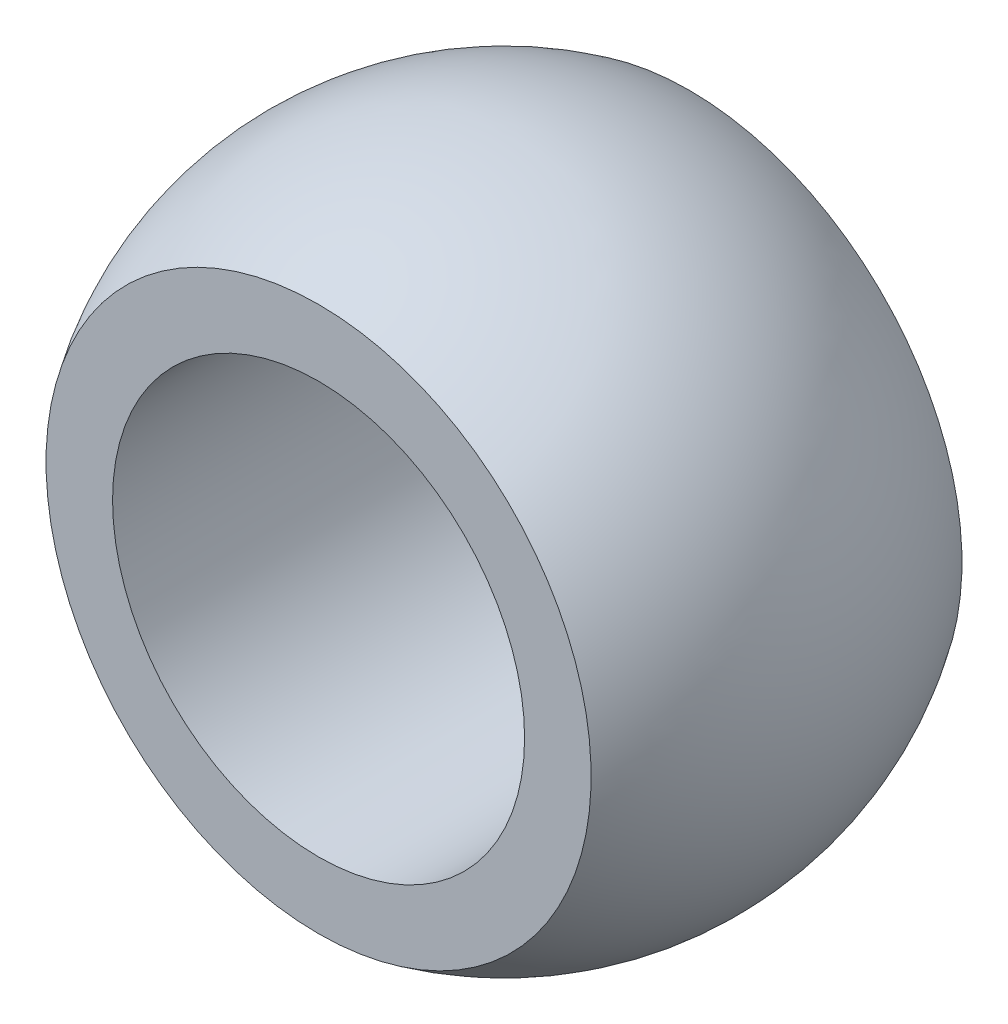
ISO-10303-21;
HEADER;
FILE_DESCRIPTION(('STEP AP214'),'2;1');
FILE_NAME('part.step','',(''),(''),'','','');
FILE_SCHEMA(('AUTOMOTIVE_DESIGN { 1 0 10303 214 1 1 1 1 }'));
ENDSEC;
DATA;
#1=APPLICATION_CONTEXT('core data for automotive mechanical design processes');
#2=APPLICATION_PROTOCOL_DEFINITION('international standard','automotive_design',2000,#1);
#3=PRODUCT_CONTEXT('',#1,'mechanical');
#4=PRODUCT('Part','Part','',(#3));
#5=PRODUCT_RELATED_PRODUCT_CATEGORY('part','',(#4));
#6=PRODUCT_DEFINITION_FORMATION('','',#4);
#7=PRODUCT_DEFINITION_CONTEXT('part definition',#1,'design');
#8=PRODUCT_DEFINITION('design','',#6,#7);
#9=PRODUCT_DEFINITION_SHAPE('','',#8);
#10=(LENGTH_UNIT() NAMED_UNIT(*) SI_UNIT(.MILLI.,.METRE.));
#11=(NAMED_UNIT(*) PLANE_ANGLE_UNIT() SI_UNIT($,.RADIAN.));
#12=(NAMED_UNIT(*) SI_UNIT($,.STERADIAN.) SOLID_ANGLE_UNIT());
#13=UNCERTAINTY_MEASURE_WITH_UNIT(LENGTH_MEASURE(1.E-05),#10,'distance_accuracy_value','');
#14=(GEOMETRIC_REPRESENTATION_CONTEXT(3) GLOBAL_UNCERTAINTY_ASSIGNED_CONTEXT((#13)) GLOBAL_UNIT_ASSIGNED_CONTEXT((#10,
#11,#12)) REPRESENTATION_CONTEXT('',''));
#15=CARTESIAN_POINT('',(0.,0.,0.));
#16=DIRECTION('',(0.,0.,1.));
#17=DIRECTION('',(1.,0.,0.));
#18=AXIS2_PLACEMENT_3D('',#15,#16,#17);
#19=CARTESIAN_POINT('',(0.,0.,12.));
#20=DIRECTION('',(0.,0.,1.));
#21=DIRECTION('',(1.,0.,0.));
#22=AXIS2_PLACEMENT_3D('',#19,#20,#21);
#23=PLANE('',#22);
#24=CARTESIAN_POINT('',(0.,0.,12.));
#25=DIRECTION('',(0.,0.,1.));
#26=DIRECTION('',(0.,1.,0.));
#27=AXIS2_PLACEMENT_3D('',#24,#25,#26);
#28=CIRCLE('',#27,5.);
#29=CARTESIAN_POINT('',(0.,-5.,12.));
#30=VERTEX_POINT('',#29);
#31=EDGE_CURVE('E11',#30,#30,#28,.T.);
#32=ORIENTED_EDGE('',*,*,#31,.F.);
#33=EDGE_LOOP('',(#32));
#34=FACE_BOUND('',#33,.T.);
#35=CARTESIAN_POINT('',(0.,0.,12.));
#36=DIRECTION('',(0.,0.,-1.));
#37=DIRECTION('',(0.,-1.,0.));
#38=AXIS2_PLACEMENT_3D('',#35,#36,#37);
#39=CIRCLE('',#38,6.61437827766148);
#40=CARTESIAN_POINT('',(0.,6.61437827766148,12.));
#41=VERTEX_POINT('',#40);
#42=EDGE_CURVE('E51',#41,#41,#39,.T.);
#43=ORIENTED_EDGE('',*,*,#42,.F.);
#44=EDGE_LOOP('',(#43));
#45=FACE_BOUND('',#44,.T.);
#46=ADVANCED_FACE('F16',(#34,#45),#23,.T.);
#47=CARTESIAN_POINT('',(0.,0.,3.));
#48=DIRECTION('',(0.,0.,-1.));
#49=DIRECTION('',(0.,-1.,0.));
#50=AXIS2_PLACEMENT_3D('',#47,#48,#49);
#51=PLANE('',#50);
#52=CARTESIAN_POINT('',(0.,0.,3.));
#53=DIRECTION('',(0.,0.,-1.));
#54=DIRECTION('',(0.,1.,0.));
#55=AXIS2_PLACEMENT_3D('',#52,#53,#54);
#56=CIRCLE('',#55,5.);
#57=CARTESIAN_POINT('',(0.,-5.,3.));
#58=VERTEX_POINT('',#57);
#59=EDGE_CURVE('E20',#58,#58,#56,.T.);
#60=ORIENTED_EDGE('',*,*,#59,.F.);
#61=EDGE_LOOP('',(#60));
#62=FACE_BOUND('',#61,.T.);
#63=CARTESIAN_POINT('',(0.,0.,3.));
#64=DIRECTION('',(0.,0.,1.));
#65=DIRECTION('',(0.,1.,0.));
#66=AXIS2_PLACEMENT_3D('',#63,#64,#65);
#67=CIRCLE('',#66,6.61437827766148);
#68=CARTESIAN_POINT('',(0.,-6.61437827766148,3.));
#69=VERTEX_POINT('',#68);
#70=EDGE_CURVE('E45',#69,#69,#67,.T.);
#71=ORIENTED_EDGE('',*,*,#70,.F.);
#72=EDGE_LOOP('',(#71));
#73=FACE_BOUND('',#72,.T.);
#74=ADVANCED_FACE('F18',(#62,#73),#51,.T.);
#75=CARTESIAN_POINT('',(0.,0.,7.5));
#76=DIRECTION('',(0.,0.,-1.));
#77=DIRECTION('',(0.,1.,0.));
#78=AXIS2_PLACEMENT_3D('',#75,#76,#77);
#79=CYLINDRICAL_SURFACE('',#78,5.);
#80=ORIENTED_EDGE('',*,*,#31,.T.);
#81=EDGE_LOOP('',(#80));
#82=FACE_BOUND('',#81,.T.);
#83=ORIENTED_EDGE('',*,*,#59,.T.);
#84=EDGE_LOOP('',(#83));
#85=FACE_BOUND('',#84,.T.);
#86=ADVANCED_FACE('F67',(#82,#85),#79,.F.);
#87=CARTESIAN_POINT('',(0.,0.,7.5));
#88=DIRECTION('',(0.,-1.,0.));
#89=DIRECTION('',(0.,0.,1.));
#90=AXIS2_PLACEMENT_3D('',#87,#88,#89);
#91=SPHERICAL_SURFACE('',#90,8.);
#92=CARTESIAN_POINT('',(0.,0.,7.5));
#93=DIRECTION('',(0.,0.,1.));
#94=DIRECTION('',(0.,1.,0.));
#95=AXIS2_PLACEMENT_3D('',#92,#93,#94);
#96=SPHERICAL_SURFACE('',#95,8.);
#97=ORIENTED_EDGE('',*,*,#70,.T.);
#98=EDGE_LOOP('',(#97));
#99=FACE_BOUND('',#98,.T.);
#100=ORIENTED_EDGE('',*,*,#42,.T.);
#101=EDGE_LOOP('',(#100));
#102=FACE_BOUND('',#101,.T.);
#103=ADVANCED_FACE('F52',(#99,#102),#96,.T.);
#104=CLOSED_SHELL('',(#46,#74,#86,#103));
#105=MANIFOLD_SOLID_BREP('B1',#104);
#106=ADVANCED_BREP_SHAPE_REPRESENTATION('',(#18,#105),#14);
#107=SHAPE_DEFINITION_REPRESENTATION(#9,#106);
ENDSEC;
END-ISO-10303-21;
